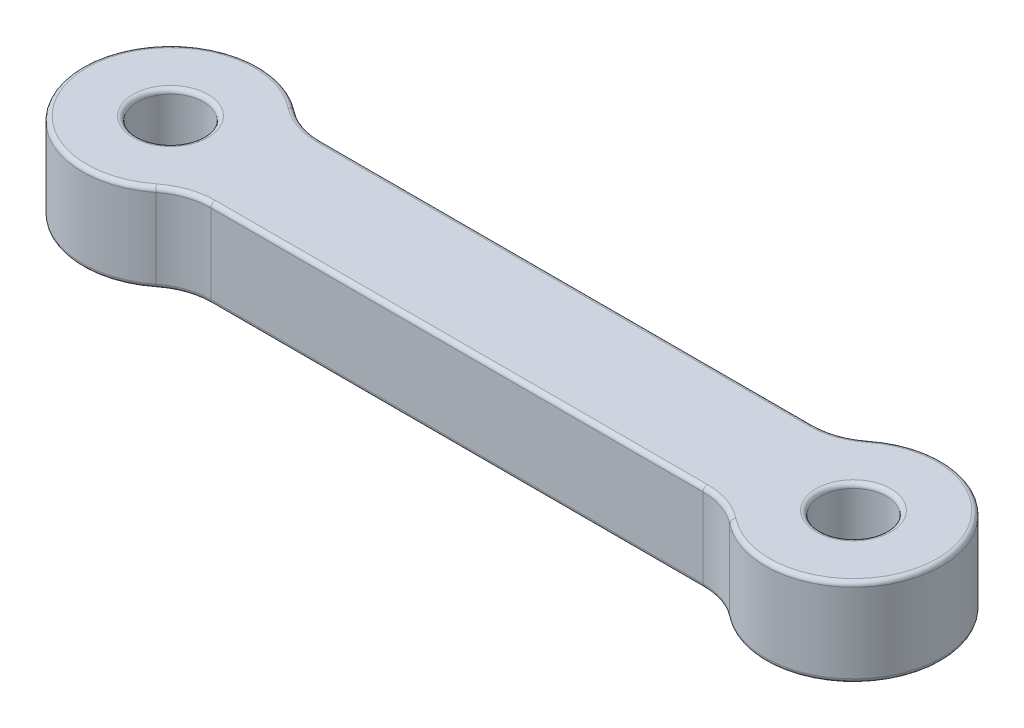
ISO-10303-21;
HEADER;
FILE_DESCRIPTION(('STEP AP214'),'2;1');
FILE_NAME('part.step','',(''),(''),'','','');
FILE_SCHEMA(('AUTOMOTIVE_DESIGN { 1 0 10303 214 1 1 1 1 }'));
ENDSEC;
DATA;
#1=APPLICATION_CONTEXT('core data for automotive mechanical design processes');
#2=APPLICATION_PROTOCOL_DEFINITION('international standard','automotive_design',2000,#1);
#3=PRODUCT_CONTEXT('',#1,'mechanical');
#4=PRODUCT('Part','Part','',(#3));
#5=PRODUCT_RELATED_PRODUCT_CATEGORY('part','',(#4));
#6=PRODUCT_DEFINITION_FORMATION('','',#4);
#7=PRODUCT_DEFINITION_CONTEXT('part definition',#1,'design');
#8=PRODUCT_DEFINITION('design','',#6,#7);
#9=PRODUCT_DEFINITION_SHAPE('','',#8);
#10=(LENGTH_UNIT() NAMED_UNIT(*) SI_UNIT(.MILLI.,.METRE.));
#11=(NAMED_UNIT(*) PLANE_ANGLE_UNIT() SI_UNIT($,.RADIAN.));
#12=(NAMED_UNIT(*) SI_UNIT($,.STERADIAN.) SOLID_ANGLE_UNIT());
#13=UNCERTAINTY_MEASURE_WITH_UNIT(LENGTH_MEASURE(1.E-05),#10,'distance_accuracy_value','');
#14=(GEOMETRIC_REPRESENTATION_CONTEXT(3) GLOBAL_UNCERTAINTY_ASSIGNED_CONTEXT((#13)) GLOBAL_UNIT_ASSIGNED_CONTEXT((#10,
#11,#12)) REPRESENTATION_CONTEXT('',''));
#15=CARTESIAN_POINT('',(0.,0.,0.));
#16=DIRECTION('',(0.,0.,1.));
#17=DIRECTION('',(1.,0.,0.));
#18=AXIS2_PLACEMENT_3D('',#15,#16,#17);
#19=CARTESIAN_POINT('',(31.,4.,0.));
#20=DIRECTION('',(0.,-1.,0.));
#21=DIRECTION('',(0.,0.,-1.));
#22=AXIS2_PLACEMENT_3D('',#19,#20,#21);
#23=CYLINDRICAL_SURFACE('',#22,4.);
#24=DIRECTION('',(0.,-1.,0.));
#25=VECTOR('',#24,1.);
#26=CARTESIAN_POINT('',(28.5256417034731,4.,3.14285714285715));
#27=LINE('',#26,#25);
#28=CARTESIAN_POINT('',(28.5256417034731,3.8,3.14285714285715));
#29=VERTEX_POINT('',#28);
#30=CARTESIAN_POINT('',(28.5256417034731,0.2,3.14285714285715));
#31=VERTEX_POINT('',#30);
#32=EDGE_CURVE('E310',#29,#31,#27,.T.);
#33=ORIENTED_EDGE('',*,*,#32,.T.);
#34=CARTESIAN_POINT('',(31.,0.2,0.));
#35=DIRECTION('',(0.,1.,0.));
#36=DIRECTION('',(0.,0.,1.));
#37=AXIS2_PLACEMENT_3D('',#34,#35,#36);
#38=CIRCLE('',#37,4.);
#39=CARTESIAN_POINT('',(28.5256417034731,0.2,-3.14285714285715));
#40=VERTEX_POINT('',#39);
#41=EDGE_CURVE('E231',#31,#40,#38,.T.);
#42=ORIENTED_EDGE('',*,*,#41,.T.);
#43=DIRECTION('',(0.,-1.,0.));
#44=VECTOR('',#43,1.);
#45=CARTESIAN_POINT('',(28.5256417034731,4.,-3.14285714285715));
#46=LINE('',#45,#44);
#47=CARTESIAN_POINT('',(28.5256417034731,3.8,-3.14285714285715));
#48=VERTEX_POINT('',#47);
#49=EDGE_CURVE('E303',#40,#48,#46,.F.);
#50=ORIENTED_EDGE('',*,*,#49,.T.);
#51=CARTESIAN_POINT('',(31.,3.8,0.));
#52=DIRECTION('',(0.,1.,0.));
#53=DIRECTION('',(0.,0.,1.));
#54=AXIS2_PLACEMENT_3D('',#51,#52,#53);
#55=CIRCLE('',#54,4.);
#56=EDGE_CURVE('E229',#48,#29,#55,.F.);
#57=ORIENTED_EDGE('',*,*,#56,.T.);
#58=EDGE_LOOP('',(#33,#42,#50,#57));
#59=FACE_BOUND('',#58,.T.);
#60=ADVANCED_FACE('F43',(#59),#23,.T.);
#61=CARTESIAN_POINT('',(0.,4.,-2.5));
#62=DIRECTION('',(0.,0.,-1.));
#63=DIRECTION('',(-1.,0.,0.));
#64=AXIS2_PLACEMENT_3D('',#61,#62,#63);
#65=PLANE('',#64);
#66=DIRECTION('',(0.,-1.,0.));
#67=VECTOR('',#66,1.);
#68=CARTESIAN_POINT('',(26.6698729810778,4.,-2.5));
#69=LINE('',#68,#67);
#70=CARTESIAN_POINT('',(26.6698729810778,3.8,-2.5));
#71=VERTEX_POINT('',#70);
#72=CARTESIAN_POINT('',(26.6698729810778,0.2,-2.5));
#73=VERTEX_POINT('',#72);
#74=EDGE_CURVE('E305',#71,#73,#69,.T.);
#75=ORIENTED_EDGE('',*,*,#74,.T.);
#76=DIRECTION('',(1.,0.,0.));
#77=VECTOR('',#76,1.);
#78=CARTESIAN_POINT('',(4.3301270189222,0.2,-2.5));
#79=LINE('',#78,#77);
#80=CARTESIAN_POINT('',(4.3301270189222,0.2,-2.5));
#81=VERTEX_POINT('',#80);
#82=EDGE_CURVE('E206',#73,#81,#79,.F.);
#83=ORIENTED_EDGE('',*,*,#82,.T.);
#84=DIRECTION('',(0.,-1.,0.));
#85=VECTOR('',#84,1.);
#86=CARTESIAN_POINT('',(4.3301270189222,4.,-2.5));
#87=LINE('',#86,#85);
#88=CARTESIAN_POINT('',(4.3301270189222,3.8,-2.5));
#89=VERTEX_POINT('',#88);
#90=EDGE_CURVE('E318',#81,#89,#87,.F.);
#91=ORIENTED_EDGE('',*,*,#90,.T.);
#92=DIRECTION('',(1.,0.,0.));
#93=VECTOR('',#92,1.);
#94=CARTESIAN_POINT('',(0.,3.8,-2.5));
#95=LINE('',#94,#93);
#96=EDGE_CURVE('E204',#89,#71,#95,.T.);
#97=ORIENTED_EDGE('',*,*,#96,.T.);
#98=EDGE_LOOP('',(#75,#83,#91,#97));
#99=FACE_BOUND('',#98,.T.);
#100=ADVANCED_FACE('F345',(#99),#65,.T.);
#101=CARTESIAN_POINT('',(0.,4.,0.));
#102=DIRECTION('',(0.,-1.,0.));
#103=DIRECTION('',(0.,0.,-1.));
#104=AXIS2_PLACEMENT_3D('',#101,#102,#103);
#105=CYLINDRICAL_SURFACE('',#104,4.);
#106=DIRECTION('',(0.,-1.,0.));
#107=VECTOR('',#106,1.);
#108=CARTESIAN_POINT('',(2.47435829652697,4.,-3.14285714285715));
#109=LINE('',#108,#107);
#110=CARTESIAN_POINT('',(2.47435829652697,3.8,-3.14285714285715));
#111=VERTEX_POINT('',#110);
#112=CARTESIAN_POINT('',(2.47435829652697,0.2,-3.14285714285715));
#113=VERTEX_POINT('',#112);
#114=EDGE_CURVE('E353',#111,#113,#109,.T.);
#115=ORIENTED_EDGE('',*,*,#114,.T.);
#116=CARTESIAN_POINT('',(0.,0.2,0.));
#117=DIRECTION('',(0.,1.,0.));
#118=DIRECTION('',(0.,0.,1.));
#119=AXIS2_PLACEMENT_3D('',#116,#117,#118);
#120=CIRCLE('',#119,4.);
#121=CARTESIAN_POINT('',(2.47435829652697,0.2,3.14285714285714));
#122=VERTEX_POINT('',#121);
#123=EDGE_CURVE('E214',#113,#122,#120,.T.);
#124=ORIENTED_EDGE('',*,*,#123,.T.);
#125=DIRECTION('',(0.,-1.,0.));
#126=VECTOR('',#125,1.);
#127=CARTESIAN_POINT('',(2.47435829652697,4.,3.14285714285714));
#128=LINE('',#127,#126);
#129=CARTESIAN_POINT('',(2.47435829652697,3.8,3.14285714285714));
#130=VERTEX_POINT('',#129);
#131=EDGE_CURVE('E348',#122,#130,#128,.F.);
#132=ORIENTED_EDGE('',*,*,#131,.T.);
#133=CARTESIAN_POINT('',(0.,3.8,0.));
#134=DIRECTION('',(0.,1.,0.));
#135=DIRECTION('',(0.,0.,1.));
#136=AXIS2_PLACEMENT_3D('',#133,#134,#135);
#137=CIRCLE('',#136,4.);
#138=EDGE_CURVE('E212',#130,#111,#137,.F.);
#139=ORIENTED_EDGE('',*,*,#138,.T.);
#140=EDGE_LOOP('',(#115,#124,#132,#139));
#141=FACE_BOUND('',#140,.T.);
#142=ADVANCED_FACE('F392',(#141),#105,.T.);
#143=CARTESIAN_POINT('',(0.,4.,2.5));
#144=DIRECTION('',(0.,0.,-1.));
#145=DIRECTION('',(-1.,0.,0.));
#146=AXIS2_PLACEMENT_3D('',#143,#144,#145);
#147=PLANE('',#146);
#148=DIRECTION('',(0.,1.,0.));
#149=VECTOR('',#148,1.);
#150=CARTESIAN_POINT('',(4.3301270189222,0.,2.5));
#151=LINE('',#150,#149);
#152=CARTESIAN_POINT('',(4.3301270189222,3.8,2.5));
#153=VERTEX_POINT('',#152);
#154=CARTESIAN_POINT('',(4.3301270189222,0.2,2.5));
#155=VERTEX_POINT('',#154);
#156=EDGE_CURVE('E358',#153,#155,#151,.F.);
#157=ORIENTED_EDGE('',*,*,#156,.T.);
#158=DIRECTION('',(1.,0.,0.));
#159=VECTOR('',#158,1.);
#160=CARTESIAN_POINT('',(0.,0.2,2.5));
#161=LINE('',#160,#159);
#162=CARTESIAN_POINT('',(26.6698729810778,0.2,2.5));
#163=VERTEX_POINT('',#162);
#164=EDGE_CURVE('E223',#155,#163,#161,.T.);
#165=ORIENTED_EDGE('',*,*,#164,.T.);
#166=DIRECTION('',(0.,1.,0.));
#167=VECTOR('',#166,1.);
#168=CARTESIAN_POINT('',(26.6698729810778,4.,2.5));
#169=LINE('',#168,#167);
#170=CARTESIAN_POINT('',(26.6698729810778,3.8,2.5));
#171=VERTEX_POINT('',#170);
#172=EDGE_CURVE('E266',#163,#171,#169,.T.);
#173=ORIENTED_EDGE('',*,*,#172,.T.);
#174=DIRECTION('',(1.,0.,0.));
#175=VECTOR('',#174,1.);
#176=CARTESIAN_POINT('',(4.3301270189222,3.8,2.5));
#177=LINE('',#176,#175);
#178=EDGE_CURVE('E221',#171,#153,#177,.F.);
#179=ORIENTED_EDGE('',*,*,#178,.T.);
#180=EDGE_LOOP('',(#157,#165,#173,#179));
#181=FACE_BOUND('',#180,.T.);
#182=ADVANCED_FACE('F368',(#181),#147,.F.);
#183=CARTESIAN_POINT('',(0.,4.,0.));
#184=DIRECTION('',(0.,1.,0.));
#185=DIRECTION('',(0.,0.,1.));
#186=AXIS2_PLACEMENT_3D('',#183,#184,#185);
#187=PLANE('',#186);
#188=CARTESIAN_POINT('',(31.,4.,0.));
#189=DIRECTION('',(0.,1.,0.));
#190=DIRECTION('',(0.,0.,1.));
#191=AXIS2_PLACEMENT_3D('',#188,#189,#190);
#192=CIRCLE('',#191,1.7);
#193=CARTESIAN_POINT('',(31.,4.,1.7));
#194=VERTEX_POINT('',#193);
#195=EDGE_CURVE('E12',#194,#194,#192,.F.);
#196=ORIENTED_EDGE('',*,*,#195,.T.);
#197=EDGE_LOOP('',(#196));
#198=FACE_BOUND('',#197,.T.);
#199=CARTESIAN_POINT('',(0.,4.,0.));
#200=DIRECTION('',(0.,1.,0.));
#201=DIRECTION('',(0.,0.,1.));
#202=AXIS2_PLACEMENT_3D('',#199,#200,#201);
#203=CIRCLE('',#202,1.7);
#204=CARTESIAN_POINT('',(0.,4.,1.7));
#205=VERTEX_POINT('',#204);
#206=EDGE_CURVE('E52',#205,#205,#203,.F.);
#207=ORIENTED_EDGE('',*,*,#206,.T.);
#208=EDGE_LOOP('',(#207));
#209=FACE_BOUND('',#208,.T.);
#210=CARTESIAN_POINT('',(0.,4.,0.));
#211=DIRECTION('',(0.,1.,0.));
#212=DIRECTION('',(0.,0.,1.));
#213=AXIS2_PLACEMENT_3D('',#210,#211,#212);
#214=CIRCLE('',#213,3.8);
#215=CARTESIAN_POINT('',(2.35064038170062,4.,-2.98571428571429));
#216=VERTEX_POINT('',#215);
#217=CARTESIAN_POINT('',(2.35064038170062,4.,2.98571428571428));
#218=VERTEX_POINT('',#217);
#219=EDGE_CURVE('E60',#216,#218,#214,.T.);
#220=ORIENTED_EDGE('',*,*,#219,.T.);
#221=CARTESIAN_POINT('',(4.3301270189222,4.,5.5));
#222=DIRECTION('',(0.,1.,0.));
#223=DIRECTION('',(0.,0.,1.));
#224=AXIS2_PLACEMENT_3D('',#221,#222,#223);
#225=CIRCLE('',#224,3.2);
#226=CARTESIAN_POINT('',(4.3301270189222,4.,2.3));
#227=VERTEX_POINT('',#226);
#228=EDGE_CURVE('E245',#218,#227,#225,.F.);
#229=ORIENTED_EDGE('',*,*,#228,.T.);
#230=DIRECTION('',(1.,0.,0.));
#231=VECTOR('',#230,1.);
#232=CARTESIAN_POINT('',(26.6698729810778,4.,2.3));
#233=LINE('',#232,#231);
#234=CARTESIAN_POINT('',(26.6698729810778,4.,2.3));
#235=VERTEX_POINT('',#234);
#236=EDGE_CURVE('E233',#227,#235,#233,.T.);
#237=ORIENTED_EDGE('',*,*,#236,.T.);
#238=CARTESIAN_POINT('',(26.6698729810778,4.,5.5));
#239=DIRECTION('',(0.,1.,0.));
#240=DIRECTION('',(0.,0.,1.));
#241=AXIS2_PLACEMENT_3D('',#238,#239,#240);
#242=CIRCLE('',#241,3.2);
#243=CARTESIAN_POINT('',(28.6493596182994,4.,2.9857142857143));
#244=VERTEX_POINT('',#243);
#245=EDGE_CURVE('E235',#235,#244,#242,.F.);
#246=ORIENTED_EDGE('',*,*,#245,.T.);
#247=CARTESIAN_POINT('',(31.,4.,0.));
#248=DIRECTION('',(0.,1.,0.));
#249=DIRECTION('',(0.,0.,1.));
#250=AXIS2_PLACEMENT_3D('',#247,#248,#249);
#251=CIRCLE('',#250,3.8);
#252=CARTESIAN_POINT('',(28.6493596182994,4.,-2.9857142857143));
#253=VERTEX_POINT('',#252);
#254=EDGE_CURVE('E237',#244,#253,#251,.T.);
#255=ORIENTED_EDGE('',*,*,#254,.T.);
#256=CARTESIAN_POINT('',(26.6698729810778,4.,-5.5));
#257=DIRECTION('',(0.,1.,0.));
#258=DIRECTION('',(0.,0.,1.));
#259=AXIS2_PLACEMENT_3D('',#256,#257,#258);
#260=CIRCLE('',#259,3.2);
#261=CARTESIAN_POINT('',(26.6698729810778,4.,-2.3));
#262=VERTEX_POINT('',#261);
#263=EDGE_CURVE('E239',#253,#262,#260,.F.);
#264=ORIENTED_EDGE('',*,*,#263,.T.);
#265=DIRECTION('',(1.,0.,0.));
#266=VECTOR('',#265,1.);
#267=CARTESIAN_POINT('',(0.,4.,-2.3));
#268=LINE('',#267,#266);
#269=CARTESIAN_POINT('',(4.3301270189222,4.,-2.3));
#270=VERTEX_POINT('',#269);
#271=EDGE_CURVE('E241',#262,#270,#268,.F.);
#272=ORIENTED_EDGE('',*,*,#271,.T.);
#273=CARTESIAN_POINT('',(4.3301270189222,4.,-5.5));
#274=DIRECTION('',(0.,1.,0.));
#275=DIRECTION('',(0.,0.,1.));
#276=AXIS2_PLACEMENT_3D('',#273,#274,#275);
#277=CIRCLE('',#276,3.2);
#278=EDGE_CURVE('E65',#270,#216,#277,.F.);
#279=ORIENTED_EDGE('',*,*,#278,.T.);
#280=EDGE_LOOP('',(#220,#229,#237,#246,#255,#264,#272,#279));
#281=FACE_BOUND('',#280,.T.);
#282=ADVANCED_FACE('F411',(#198,#209,#281),#187,.T.);
#283=CARTESIAN_POINT('',(0.,0.,0.));
#284=DIRECTION('',(0.,1.,0.));
#285=DIRECTION('',(0.,0.,1.));
#286=AXIS2_PLACEMENT_3D('',#283,#284,#285);
#287=PLANE('',#286);
#288=CARTESIAN_POINT('',(31.,0.,0.));
#289=DIRECTION('',(0.,1.,0.));
#290=DIRECTION('',(0.,0.,1.));
#291=AXIS2_PLACEMENT_3D('',#288,#289,#290);
#292=CIRCLE('',#291,1.7);
#293=CARTESIAN_POINT('',(31.,0.,1.7));
#294=VERTEX_POINT('',#293);
#295=EDGE_CURVE('E187',#294,#294,#292,.T.);
#296=ORIENTED_EDGE('',*,*,#295,.T.);
#297=EDGE_LOOP('',(#296));
#298=FACE_BOUND('',#297,.T.);
#299=CARTESIAN_POINT('',(0.,0.,0.));
#300=DIRECTION('',(0.,1.,0.));
#301=DIRECTION('',(0.,0.,1.));
#302=AXIS2_PLACEMENT_3D('',#299,#300,#301);
#303=CIRCLE('',#302,1.7);
#304=CARTESIAN_POINT('',(0.,0.,1.7));
#305=VERTEX_POINT('',#304);
#306=EDGE_CURVE('E184',#305,#305,#303,.T.);
#307=ORIENTED_EDGE('',*,*,#306,.T.);
#308=EDGE_LOOP('',(#307));
#309=FACE_BOUND('',#308,.T.);
#310=DIRECTION('',(1.,0.,0.));
#311=VECTOR('',#310,1.);
#312=CARTESIAN_POINT('',(26.6698729810778,0.,-2.3));
#313=LINE('',#312,#311);
#314=CARTESIAN_POINT('',(4.3301270189222,0.,-2.3));
#315=VERTEX_POINT('',#314);
#316=CARTESIAN_POINT('',(26.6698729810778,0.,-2.3));
#317=VERTEX_POINT('',#316);
#318=EDGE_CURVE('E182',#315,#317,#313,.T.);
#319=ORIENTED_EDGE('',*,*,#318,.T.);
#320=CARTESIAN_POINT('',(26.6698729810778,0.,-5.5));
#321=DIRECTION('',(0.,1.,0.));
#322=DIRECTION('',(0.,0.,1.));
#323=AXIS2_PLACEMENT_3D('',#320,#321,#322);
#324=CIRCLE('',#323,3.2);
#325=CARTESIAN_POINT('',(28.6493596182994,0.,-2.9857142857143));
#326=VERTEX_POINT('',#325);
#327=EDGE_CURVE('E163',#317,#326,#324,.T.);
#328=ORIENTED_EDGE('',*,*,#327,.T.);
#329=CARTESIAN_POINT('',(31.,0.,0.));
#330=DIRECTION('',(0.,1.,0.));
#331=DIRECTION('',(0.,0.,1.));
#332=AXIS2_PLACEMENT_3D('',#329,#330,#331);
#333=CIRCLE('',#332,3.8);
#334=CARTESIAN_POINT('',(28.6493596182994,0.,2.9857142857143));
#335=VERTEX_POINT('',#334);
#336=EDGE_CURVE('E171',#326,#335,#333,.F.);
#337=ORIENTED_EDGE('',*,*,#336,.T.);
#338=CARTESIAN_POINT('',(26.6698729810778,0.,5.5));
#339=DIRECTION('',(0.,1.,0.));
#340=DIRECTION('',(0.,0.,1.));
#341=AXIS2_PLACEMENT_3D('',#338,#339,#340);
#342=CIRCLE('',#341,3.2);
#343=CARTESIAN_POINT('',(26.6698729810778,0.,2.3));
#344=VERTEX_POINT('',#343);
#345=EDGE_CURVE('E177',#335,#344,#342,.T.);
#346=ORIENTED_EDGE('',*,*,#345,.T.);
#347=DIRECTION('',(1.,0.,0.));
#348=VECTOR('',#347,1.);
#349=CARTESIAN_POINT('',(0.,0.,2.3));
#350=LINE('',#349,#348);
#351=CARTESIAN_POINT('',(4.3301270189222,0.,2.3));
#352=VERTEX_POINT('',#351);
#353=EDGE_CURVE('E327',#344,#352,#350,.F.);
#354=ORIENTED_EDGE('',*,*,#353,.T.);
#355=CARTESIAN_POINT('',(4.3301270189222,0.,5.5));
#356=DIRECTION('',(0.,1.,0.));
#357=DIRECTION('',(0.,0.,1.));
#358=AXIS2_PLACEMENT_3D('',#355,#356,#357);
#359=CIRCLE('',#358,3.2);
#360=CARTESIAN_POINT('',(2.35064038170062,0.,2.98571428571428));
#361=VERTEX_POINT('',#360);
#362=EDGE_CURVE('E329',#352,#361,#359,.T.);
#363=ORIENTED_EDGE('',*,*,#362,.T.);
#364=CARTESIAN_POINT('',(0.,0.,0.));
#365=DIRECTION('',(0.,1.,0.));
#366=DIRECTION('',(0.,0.,1.));
#367=AXIS2_PLACEMENT_3D('',#364,#365,#366);
#368=CIRCLE('',#367,3.8);
#369=CARTESIAN_POINT('',(2.35064038170062,0.,-2.98571428571429));
#370=VERTEX_POINT('',#369);
#371=EDGE_CURVE('E331',#361,#370,#368,.F.);
#372=ORIENTED_EDGE('',*,*,#371,.T.);
#373=CARTESIAN_POINT('',(4.3301270189222,0.,-5.5));
#374=DIRECTION('',(0.,1.,0.));
#375=DIRECTION('',(0.,0.,1.));
#376=AXIS2_PLACEMENT_3D('',#373,#374,#375);
#377=CIRCLE('',#376,3.2);
#378=EDGE_CURVE('E189',#370,#315,#377,.T.);
#379=ORIENTED_EDGE('',*,*,#378,.T.);
#380=EDGE_LOOP('',(#319,#328,#337,#346,#354,#363,#372,#379));
#381=FACE_BOUND('',#380,.T.);
#382=ADVANCED_FACE('F180',(#298,#309,#381),#287,.F.);
#383=CARTESIAN_POINT('',(4.3301270189222,4.,5.5));
#384=DIRECTION('',(0.,-1.,0.));
#385=DIRECTION('',(0.,0.,-1.));
#386=AXIS2_PLACEMENT_3D('',#383,#384,#385);
#387=CYLINDRICAL_SURFACE('',#386,3.);
#388=ORIENTED_EDGE('',*,*,#131,.F.);
#389=CARTESIAN_POINT('',(4.3301270189222,0.2,5.5));
#390=DIRECTION('',(0.,1.,0.));
#391=DIRECTION('',(0.,0.,1.));
#392=AXIS2_PLACEMENT_3D('',#389,#390,#391);
#393=CIRCLE('',#392,3.);
#394=EDGE_CURVE('E219',#122,#155,#393,.F.);
#395=ORIENTED_EDGE('',*,*,#394,.T.);
#396=ORIENTED_EDGE('',*,*,#156,.F.);
#397=CARTESIAN_POINT('',(4.3301270189222,3.8,5.5));
#398=DIRECTION('',(0.,1.,0.));
#399=DIRECTION('',(0.,0.,1.));
#400=AXIS2_PLACEMENT_3D('',#397,#398,#399);
#401=CIRCLE('',#400,3.);
#402=EDGE_CURVE('E216',#153,#130,#401,.T.);
#403=ORIENTED_EDGE('',*,*,#402,.T.);
#404=EDGE_LOOP('',(#388,#395,#396,#403));
#405=FACE_BOUND('',#404,.T.);
#406=ADVANCED_FACE('F389',(#405),#387,.F.);
#407=CARTESIAN_POINT('',(26.6698729810778,4.,5.5));
#408=DIRECTION('',(0.,-1.,0.));
#409=DIRECTION('',(0.,0.,-1.));
#410=AXIS2_PLACEMENT_3D('',#407,#408,#409);
#411=CYLINDRICAL_SURFACE('',#410,3.);
#412=ORIENTED_EDGE('',*,*,#172,.F.);
#413=CARTESIAN_POINT('',(26.6698729810778,0.2,5.5));
#414=DIRECTION('',(0.,1.,0.));
#415=DIRECTION('',(0.,0.,1.));
#416=AXIS2_PLACEMENT_3D('',#413,#414,#415);
#417=CIRCLE('',#416,3.);
#418=EDGE_CURVE('E227',#163,#31,#417,.F.);
#419=ORIENTED_EDGE('',*,*,#418,.T.);
#420=ORIENTED_EDGE('',*,*,#32,.F.);
#421=CARTESIAN_POINT('',(26.6698729810778,3.8,5.5));
#422=DIRECTION('',(0.,1.,0.));
#423=DIRECTION('',(0.,0.,1.));
#424=AXIS2_PLACEMENT_3D('',#421,#422,#423);
#425=CIRCLE('',#424,3.);
#426=EDGE_CURVE('E225',#29,#171,#425,.T.);
#427=ORIENTED_EDGE('',*,*,#426,.T.);
#428=EDGE_LOOP('',(#412,#419,#420,#427));
#429=FACE_BOUND('',#428,.T.);
#430=ADVANCED_FACE('F408',(#429),#411,.F.);
#431=CARTESIAN_POINT('',(26.6698729810778,4.,-5.5));
#432=DIRECTION('',(0.,-1.,0.));
#433=DIRECTION('',(0.,0.,-1.));
#434=AXIS2_PLACEMENT_3D('',#431,#432,#433);
#435=CYLINDRICAL_SURFACE('',#434,3.);
#436=ORIENTED_EDGE('',*,*,#49,.F.);
#437=CARTESIAN_POINT('',(26.6698729810778,0.2,-5.5));
#438=DIRECTION('',(0.,1.,0.));
#439=DIRECTION('',(0.,0.,1.));
#440=AXIS2_PLACEMENT_3D('',#437,#438,#439);
#441=CIRCLE('',#440,3.);
#442=EDGE_CURVE('E165',#40,#73,#441,.F.);
#443=ORIENTED_EDGE('',*,*,#442,.T.);
#444=ORIENTED_EDGE('',*,*,#74,.F.);
#445=CARTESIAN_POINT('',(26.6698729810778,3.8,-5.5));
#446=DIRECTION('',(0.,1.,0.));
#447=DIRECTION('',(0.,0.,1.));
#448=AXIS2_PLACEMENT_3D('',#445,#446,#447);
#449=CIRCLE('',#448,3.);
#450=EDGE_CURVE('E201',#71,#48,#449,.T.);
#451=ORIENTED_EDGE('',*,*,#450,.T.);
#452=EDGE_LOOP('',(#436,#443,#444,#451));
#453=FACE_BOUND('',#452,.T.);
#454=ADVANCED_FACE('F302',(#453),#435,.F.);
#455=CARTESIAN_POINT('',(4.3301270189222,4.,-5.5));
#456=DIRECTION('',(0.,-1.,0.));
#457=DIRECTION('',(0.,0.,-1.));
#458=AXIS2_PLACEMENT_3D('',#455,#456,#457);
#459=CYLINDRICAL_SURFACE('',#458,3.);
#460=ORIENTED_EDGE('',*,*,#90,.F.);
#461=CARTESIAN_POINT('',(4.3301270189222,0.2,-5.5));
#462=DIRECTION('',(0.,1.,0.));
#463=DIRECTION('',(0.,0.,1.));
#464=AXIS2_PLACEMENT_3D('',#461,#462,#463);
#465=CIRCLE('',#464,3.);
#466=EDGE_CURVE('E210',#81,#113,#465,.F.);
#467=ORIENTED_EDGE('',*,*,#466,.T.);
#468=ORIENTED_EDGE('',*,*,#114,.F.);
#469=CARTESIAN_POINT('',(4.3301270189222,3.8,-5.5));
#470=DIRECTION('',(0.,1.,0.));
#471=DIRECTION('',(0.,0.,1.));
#472=AXIS2_PLACEMENT_3D('',#469,#470,#471);
#473=CIRCLE('',#472,3.);
#474=EDGE_CURVE('E208',#111,#89,#473,.T.);
#475=ORIENTED_EDGE('',*,*,#474,.T.);
#476=EDGE_LOOP('',(#460,#467,#468,#475));
#477=FACE_BOUND('',#476,.T.);
#478=ADVANCED_FACE('F604',(#477),#459,.F.);
#479=CARTESIAN_POINT('',(0.,4.,0.));
#480=DIRECTION('',(0.,-1.,0.));
#481=DIRECTION('',(0.,0.,-1.));
#482=AXIS2_PLACEMENT_3D('',#479,#480,#481);
#483=CYLINDRICAL_SURFACE('',#482,1.5);
#484=CARTESIAN_POINT('',(0.,0.2,0.));
#485=DIRECTION('',(0.,1.,0.));
#486=DIRECTION('',(0.,0.,1.));
#487=AXIS2_PLACEMENT_3D('',#484,#485,#486);
#488=CIRCLE('',#487,1.5);
#489=CARTESIAN_POINT('',(0.,0.2,1.5));
#490=VERTEX_POINT('',#489);
#491=EDGE_CURVE('E198',#490,#490,#488,.F.);
#492=ORIENTED_EDGE('',*,*,#491,.T.);
#493=EDGE_LOOP('',(#492));
#494=FACE_BOUND('',#493,.T.);
#495=CARTESIAN_POINT('',(0.,3.8,0.));
#496=DIRECTION('',(0.,1.,0.));
#497=DIRECTION('',(0.,0.,1.));
#498=AXIS2_PLACEMENT_3D('',#495,#496,#497);
#499=CIRCLE('',#498,1.5);
#500=CARTESIAN_POINT('',(0.,3.8,1.5));
#501=VERTEX_POINT('',#500);
#502=EDGE_CURVE('E195',#501,#501,#499,.T.);
#503=ORIENTED_EDGE('',*,*,#502,.T.);
#504=EDGE_LOOP('',(#503));
#505=FACE_BOUND('',#504,.T.);
#506=ADVANCED_FACE('F594',(#494,#505),#483,.F.);
#507=CARTESIAN_POINT('',(31.,4.,0.));
#508=DIRECTION('',(0.,-1.,0.));
#509=DIRECTION('',(0.,0.,-1.));
#510=AXIS2_PLACEMENT_3D('',#507,#508,#509);
#511=CYLINDRICAL_SURFACE('',#510,1.5);
#512=CARTESIAN_POINT('',(31.,0.2,0.));
#513=DIRECTION('',(0.,1.,0.));
#514=DIRECTION('',(0.,0.,1.));
#515=AXIS2_PLACEMENT_3D('',#512,#513,#514);
#516=CIRCLE('',#515,1.5);
#517=CARTESIAN_POINT('',(31.,0.2,1.5));
#518=VERTEX_POINT('',#517);
#519=EDGE_CURVE('E178',#518,#518,#516,.F.);
#520=ORIENTED_EDGE('',*,*,#519,.T.);
#521=EDGE_LOOP('',(#520));
#522=FACE_BOUND('',#521,.T.);
#523=CARTESIAN_POINT('',(31.,3.8,0.));
#524=DIRECTION('',(0.,1.,0.));
#525=DIRECTION('',(0.,0.,1.));
#526=AXIS2_PLACEMENT_3D('',#523,#524,#525);
#527=CIRCLE('',#526,1.5);
#528=CARTESIAN_POINT('',(31.,3.8,1.5));
#529=VERTEX_POINT('',#528);
#530=EDGE_CURVE('E316',#529,#529,#527,.T.);
#531=ORIENTED_EDGE('',*,*,#530,.T.);
#532=EDGE_LOOP('',(#531));
#533=FACE_BOUND('',#532,.T.);
#534=ADVANCED_FACE('F437',(#522,#533),#511,.F.);
#535=CARTESIAN_POINT('',(31.,0.2,0.));
#536=DIRECTION('',(0.,1.,0.));
#537=DIRECTION('',(0.,0.,1.));
#538=AXIS2_PLACEMENT_3D('',#535,#536,#537);
#539=TOROIDAL_SURFACE('',#538,1.7,0.2);
#540=ORIENTED_EDGE('',*,*,#295,.F.);
#541=EDGE_LOOP('',(#540));
#542=FACE_BOUND('',#541,.T.);
#543=ORIENTED_EDGE('',*,*,#519,.F.);
#544=EDGE_LOOP('',(#543));
#545=FACE_BOUND('',#544,.T.);
#546=ADVANCED_FACE('F433',(#542,#545),#539,.T.);
#547=CARTESIAN_POINT('',(0.,0.2,0.));
#548=DIRECTION('',(0.,1.,0.));
#549=DIRECTION('',(0.,0.,1.));
#550=AXIS2_PLACEMENT_3D('',#547,#548,#549);
#551=TOROIDAL_SURFACE('',#550,1.7,0.2);
#552=ORIENTED_EDGE('',*,*,#306,.F.);
#553=EDGE_LOOP('',(#552));
#554=FACE_BOUND('',#553,.T.);
#555=ORIENTED_EDGE('',*,*,#491,.F.);
#556=EDGE_LOOP('',(#555));
#557=FACE_BOUND('',#556,.T.);
#558=ADVANCED_FACE('F436',(#554,#557),#551,.T.);
#559=CARTESIAN_POINT('',(4.3301270189222,0.2,5.5));
#560=DIRECTION('',(0.,1.,0.));
#561=DIRECTION('',(0.,0.,1.));
#562=AXIS2_PLACEMENT_3D('',#559,#560,#561);
#563=TOROIDAL_SURFACE('',#562,3.2,0.2);
#564=CARTESIAN_POINT('',(4.3301270189222,0.2,2.3));
#565=DIRECTION('',(1.,0.,0.));
#566=DIRECTION('',(0.,0.,-1.));
#567=AXIS2_PLACEMENT_3D('',#564,#565,#566);
#568=CIRCLE('',#567,0.2);
#569=EDGE_CURVE('E260',#155,#352,#568,.T.);
#570=ORIENTED_EDGE('',*,*,#569,.F.);
#571=ORIENTED_EDGE('',*,*,#394,.F.);
#572=CARTESIAN_POINT('',(2.35064038170062,0.2,2.98571428571428));
#573=DIRECTION('',(-0.785714285714285,0.,0.618589574131743));
#574=DIRECTION('',(0.618589574131743,0.,0.785714285714285));
#575=AXIS2_PLACEMENT_3D('',#572,#573,#574);
#576=CIRCLE('',#575,0.2);
#577=EDGE_CURVE('E263',#361,#122,#576,.T.);
#578=ORIENTED_EDGE('',*,*,#577,.F.);
#579=ORIENTED_EDGE('',*,*,#362,.F.);
#580=EDGE_LOOP('',(#570,#571,#578,#579));
#581=FACE_BOUND('',#580,.T.);
#582=ADVANCED_FACE('F401',(#581),#563,.T.);
#583=CARTESIAN_POINT('',(0.,0.2,0.));
#584=DIRECTION('',(0.,1.,0.));
#585=DIRECTION('',(0.,0.,1.));
#586=AXIS2_PLACEMENT_3D('',#583,#584,#585);
#587=TOROIDAL_SURFACE('',#586,3.8,0.2);
#588=ORIENTED_EDGE('',*,*,#577,.T.);
#589=ORIENTED_EDGE('',*,*,#123,.F.);
#590=CARTESIAN_POINT('',(2.35064038170062,0.2,-2.98571428571429));
#591=DIRECTION('',(0.785714285714285,0.,0.618589574131743));
#592=DIRECTION('',(0.618589574131743,0.,-0.785714285714285));
#593=AXIS2_PLACEMENT_3D('',#590,#591,#592);
#594=CIRCLE('',#593,0.2);
#595=EDGE_CURVE('E257',#370,#113,#594,.T.);
#596=ORIENTED_EDGE('',*,*,#595,.F.);
#597=ORIENTED_EDGE('',*,*,#371,.F.);
#598=EDGE_LOOP('',(#588,#589,#596,#597));
#599=FACE_BOUND('',#598,.T.);
#600=ADVANCED_FACE('F396',(#599),#587,.T.);
#601=CARTESIAN_POINT('',(0.,0.2,2.3));
#602=DIRECTION('',(1.,0.,0.));
#603=DIRECTION('',(0.,0.,-1.));
#604=AXIS2_PLACEMENT_3D('',#601,#602,#603);
#605=CYLINDRICAL_SURFACE('',#604,0.2);
#606=ORIENTED_EDGE('',*,*,#569,.T.);
#607=ORIENTED_EDGE('',*,*,#353,.F.);
#608=CARTESIAN_POINT('',(26.6698729810778,0.2,2.3));
#609=DIRECTION('',(1.,0.,0.));
#610=DIRECTION('',(0.,0.,-1.));
#611=AXIS2_PLACEMENT_3D('',#608,#609,#610);
#612=CIRCLE('',#611,0.2);
#613=EDGE_CURVE('E254',#163,#344,#612,.T.);
#614=ORIENTED_EDGE('',*,*,#613,.F.);
#615=ORIENTED_EDGE('',*,*,#164,.F.);
#616=EDGE_LOOP('',(#606,#607,#614,#615));
#617=FACE_BOUND('',#616,.T.);
#618=ADVANCED_FACE('F404',(#617),#605,.T.);
#619=CARTESIAN_POINT('',(4.3301270189222,0.2,-5.5));
#620=DIRECTION('',(0.,1.,0.));
#621=DIRECTION('',(0.,0.,1.));
#622=AXIS2_PLACEMENT_3D('',#619,#620,#621);
#623=TOROIDAL_SURFACE('',#622,3.2,0.2);
#624=ORIENTED_EDGE('',*,*,#595,.T.);
#625=ORIENTED_EDGE('',*,*,#466,.F.);
#626=CARTESIAN_POINT('',(4.3301270189222,0.2,-2.3));
#627=DIRECTION('',(1.,0.,0.));
#628=DIRECTION('',(0.,0.,-1.));
#629=AXIS2_PLACEMENT_3D('',#626,#627,#628);
#630=CIRCLE('',#629,0.2);
#631=EDGE_CURVE('E251',#315,#81,#630,.T.);
#632=ORIENTED_EDGE('',*,*,#631,.F.);
#633=ORIENTED_EDGE('',*,*,#378,.F.);
#634=EDGE_LOOP('',(#624,#625,#632,#633));
#635=FACE_BOUND('',#634,.T.);
#636=ADVANCED_FACE('F338',(#635),#623,.T.);
#637=CARTESIAN_POINT('',(26.6698729810778,0.2,5.5));
#638=DIRECTION('',(0.,1.,0.));
#639=DIRECTION('',(0.,0.,1.));
#640=AXIS2_PLACEMENT_3D('',#637,#638,#639);
#641=TOROIDAL_SURFACE('',#640,3.2,0.2);
#642=ORIENTED_EDGE('',*,*,#613,.T.);
#643=ORIENTED_EDGE('',*,*,#345,.F.);
#644=CARTESIAN_POINT('',(28.6493596182994,0.2,2.9857142857143));
#645=DIRECTION('',(0.785714285714282,0.,0.618589574131746));
#646=DIRECTION('',(0.618589574131746,0.,-0.785714285714282));
#647=AXIS2_PLACEMENT_3D('',#644,#645,#646);
#648=CIRCLE('',#647,0.2);
#649=EDGE_CURVE('E174',#31,#335,#648,.T.);
#650=ORIENTED_EDGE('',*,*,#649,.F.);
#651=ORIENTED_EDGE('',*,*,#418,.F.);
#652=EDGE_LOOP('',(#642,#643,#650,#651));
#653=FACE_BOUND('',#652,.T.);
#654=ADVANCED_FACE('F407',(#653),#641,.T.);
#655=CARTESIAN_POINT('',(0.,0.2,-2.3));
#656=DIRECTION('',(-1.,0.,0.));
#657=DIRECTION('',(0.,0.,1.));
#658=AXIS2_PLACEMENT_3D('',#655,#656,#657);
#659=CYLINDRICAL_SURFACE('',#658,0.2);
#660=ORIENTED_EDGE('',*,*,#631,.T.);
#661=ORIENTED_EDGE('',*,*,#82,.F.);
#662=CARTESIAN_POINT('',(26.6698729810778,0.2,-2.3));
#663=DIRECTION('',(1.,0.,0.));
#664=DIRECTION('',(0.,0.,-1.));
#665=AXIS2_PLACEMENT_3D('',#662,#663,#664);
#666=CIRCLE('',#665,0.2);
#667=EDGE_CURVE('E168',#317,#73,#666,.T.);
#668=ORIENTED_EDGE('',*,*,#667,.F.);
#669=ORIENTED_EDGE('',*,*,#318,.F.);
#670=EDGE_LOOP('',(#660,#661,#668,#669));
#671=FACE_BOUND('',#670,.T.);
#672=ADVANCED_FACE('F341',(#671),#659,.T.);
#673=CARTESIAN_POINT('',(31.,0.2,0.));
#674=DIRECTION('',(0.,1.,0.));
#675=DIRECTION('',(0.,0.,1.));
#676=AXIS2_PLACEMENT_3D('',#673,#674,#675);
#677=TOROIDAL_SURFACE('',#676,3.8,0.2);
#678=ORIENTED_EDGE('',*,*,#649,.T.);
#679=ORIENTED_EDGE('',*,*,#336,.F.);
#680=CARTESIAN_POINT('',(28.6493596182994,0.2,-2.9857142857143));
#681=DIRECTION('',(-0.785714285714285,0.,0.618589574131743));
#682=DIRECTION('',(0.618589574131743,0.,0.785714285714285));
#683=AXIS2_PLACEMENT_3D('',#680,#681,#682);
#684=CIRCLE('',#683,0.2);
#685=EDGE_CURVE('E159',#40,#326,#684,.T.);
#686=ORIENTED_EDGE('',*,*,#685,.F.);
#687=ORIENTED_EDGE('',*,*,#41,.F.);
#688=EDGE_LOOP('',(#678,#679,#686,#687));
#689=FACE_BOUND('',#688,.T.);
#690=ADVANCED_FACE('F172',(#689),#677,.T.);
#691=CARTESIAN_POINT('',(26.6698729810778,0.2,-5.5));
#692=DIRECTION('',(0.,1.,0.));
#693=DIRECTION('',(0.,0.,1.));
#694=AXIS2_PLACEMENT_3D('',#691,#692,#693);
#695=TOROIDAL_SURFACE('',#694,3.2,0.2);
#696=ORIENTED_EDGE('',*,*,#667,.T.);
#697=ORIENTED_EDGE('',*,*,#442,.F.);
#698=ORIENTED_EDGE('',*,*,#685,.T.);
#699=ORIENTED_EDGE('',*,*,#327,.F.);
#700=EDGE_LOOP('',(#696,#697,#698,#699));
#701=FACE_BOUND('',#700,.T.);
#702=ADVANCED_FACE('F161',(#701),#695,.T.);
#703=CARTESIAN_POINT('',(31.,3.8,0.));
#704=DIRECTION('',(0.,1.,0.));
#705=DIRECTION('',(0.,0.,1.));
#706=AXIS2_PLACEMENT_3D('',#703,#704,#705);
#707=TOROIDAL_SURFACE('',#706,1.7,0.2);
#708=ORIENTED_EDGE('',*,*,#530,.F.);
#709=EDGE_LOOP('',(#708));
#710=FACE_BOUND('',#709,.T.);
#711=ORIENTED_EDGE('',*,*,#195,.F.);
#712=EDGE_LOOP('',(#711));
#713=FACE_BOUND('',#712,.T.);
#714=ADVANCED_FACE('F444',(#710,#713),#707,.T.);
#715=CARTESIAN_POINT('',(0.,3.8,0.));
#716=DIRECTION('',(0.,1.,0.));
#717=DIRECTION('',(0.,0.,1.));
#718=AXIS2_PLACEMENT_3D('',#715,#716,#717);
#719=TOROIDAL_SURFACE('',#718,1.7,0.2);
#720=ORIENTED_EDGE('',*,*,#502,.F.);
#721=EDGE_LOOP('',(#720));
#722=FACE_BOUND('',#721,.T.);
#723=ORIENTED_EDGE('',*,*,#206,.F.);
#724=EDGE_LOOP('',(#723));
#725=FACE_BOUND('',#724,.T.);
#726=ADVANCED_FACE('F461',(#722,#725),#719,.T.);
#727=CARTESIAN_POINT('',(26.6698729810778,3.8,-5.5));
#728=DIRECTION('',(0.,1.,0.));
#729=DIRECTION('',(0.,0.,1.));
#730=AXIS2_PLACEMENT_3D('',#727,#728,#729);
#731=TOROIDAL_SURFACE('',#730,3.2,0.2);
#732=CARTESIAN_POINT('',(28.6493596182994,3.8,-2.9857142857143));
#733=DIRECTION('',(0.785714285714282,0.,-0.618589574131746));
#734=DIRECTION('',(-0.618589574131746,0.,-0.785714285714282));
#735=AXIS2_PLACEMENT_3D('',#732,#733,#734);
#736=CIRCLE('',#735,0.2);
#737=EDGE_CURVE('E282',#48,#253,#736,.T.);
#738=ORIENTED_EDGE('',*,*,#737,.F.);
#739=ORIENTED_EDGE('',*,*,#450,.F.);
#740=CARTESIAN_POINT('',(26.6698729810778,3.8,-2.3));
#741=DIRECTION('',(-1.,0.,0.));
#742=DIRECTION('',(0.,0.,1.));
#743=AXIS2_PLACEMENT_3D('',#740,#741,#742);
#744=CIRCLE('',#743,0.2);
#745=EDGE_CURVE('E47',#262,#71,#744,.T.);
#746=ORIENTED_EDGE('',*,*,#745,.F.);
#747=ORIENTED_EDGE('',*,*,#263,.F.);
#748=EDGE_LOOP('',(#738,#739,#746,#747));
#749=FACE_BOUND('',#748,.T.);
#750=ADVANCED_FACE('F45',(#749),#731,.T.);
#751=CARTESIAN_POINT('',(0.,3.8,-2.3));
#752=DIRECTION('',(1.,0.,0.));
#753=DIRECTION('',(0.,0.,-1.));
#754=AXIS2_PLACEMENT_3D('',#751,#752,#753);
#755=CYLINDRICAL_SURFACE('',#754,0.2);
#756=ORIENTED_EDGE('',*,*,#745,.T.);
#757=ORIENTED_EDGE('',*,*,#96,.F.);
#758=CARTESIAN_POINT('',(4.3301270189222,3.8,-2.3));
#759=DIRECTION('',(-1.,0.,0.));
#760=DIRECTION('',(0.,0.,1.));
#761=AXIS2_PLACEMENT_3D('',#758,#759,#760);
#762=CIRCLE('',#761,0.2);
#763=EDGE_CURVE('E280',#270,#89,#762,.T.);
#764=ORIENTED_EDGE('',*,*,#763,.F.);
#765=ORIENTED_EDGE('',*,*,#271,.F.);
#766=EDGE_LOOP('',(#756,#757,#764,#765));
#767=FACE_BOUND('',#766,.T.);
#768=ADVANCED_FACE('F293',(#767),#755,.T.);
#769=CARTESIAN_POINT('',(31.,3.8,0.));
#770=DIRECTION('',(0.,1.,0.));
#771=DIRECTION('',(0.,0.,1.));
#772=AXIS2_PLACEMENT_3D('',#769,#770,#771);
#773=TOROIDAL_SURFACE('',#772,3.8,0.2);
#774=ORIENTED_EDGE('',*,*,#737,.T.);
#775=ORIENTED_EDGE('',*,*,#254,.F.);
#776=CARTESIAN_POINT('',(28.6493596182994,3.8,2.9857142857143));
#777=DIRECTION('',(-0.785714285714286,0.,-0.618589574131742));
#778=DIRECTION('',(-0.618589574131742,0.,0.785714285714286));
#779=AXIS2_PLACEMENT_3D('',#776,#777,#778);
#780=CIRCLE('',#779,0.2);
#781=EDGE_CURVE('E277',#29,#244,#780,.T.);
#782=ORIENTED_EDGE('',*,*,#781,.F.);
#783=ORIENTED_EDGE('',*,*,#56,.F.);
#784=EDGE_LOOP('',(#774,#775,#782,#783));
#785=FACE_BOUND('',#784,.T.);
#786=ADVANCED_FACE('F410',(#785),#773,.T.);
#787=CARTESIAN_POINT('',(4.3301270189222,3.8,-5.5));
#788=DIRECTION('',(0.,1.,0.));
#789=DIRECTION('',(0.,0.,1.));
#790=AXIS2_PLACEMENT_3D('',#787,#788,#789);
#791=TOROIDAL_SURFACE('',#790,3.2,0.2);
#792=ORIENTED_EDGE('',*,*,#763,.T.);
#793=ORIENTED_EDGE('',*,*,#474,.F.);
#794=CARTESIAN_POINT('',(2.35064038170062,3.8,-2.98571428571429));
#795=DIRECTION('',(-0.785714285714286,0.,-0.618589574131742));
#796=DIRECTION('',(-0.618589574131742,0.,0.785714285714286));
#797=AXIS2_PLACEMENT_3D('',#794,#795,#796);
#798=CIRCLE('',#797,0.2);
#799=EDGE_CURVE('E274',#216,#111,#798,.T.);
#800=ORIENTED_EDGE('',*,*,#799,.F.);
#801=ORIENTED_EDGE('',*,*,#278,.F.);
#802=EDGE_LOOP('',(#792,#793,#800,#801));
#803=FACE_BOUND('',#802,.T.);
#804=ADVANCED_FACE('F414',(#803),#791,.T.);
#805=CARTESIAN_POINT('',(26.6698729810778,3.8,5.5));
#806=DIRECTION('',(0.,1.,0.));
#807=DIRECTION('',(0.,0.,1.));
#808=AXIS2_PLACEMENT_3D('',#805,#806,#807);
#809=TOROIDAL_SURFACE('',#808,3.2,0.2);
#810=ORIENTED_EDGE('',*,*,#781,.T.);
#811=ORIENTED_EDGE('',*,*,#245,.F.);
#812=CARTESIAN_POINT('',(26.6698729810778,3.8,2.3));
#813=DIRECTION('',(-1.,0.,0.));
#814=DIRECTION('',(0.,0.,1.));
#815=AXIS2_PLACEMENT_3D('',#812,#813,#814);
#816=CIRCLE('',#815,0.2);
#817=EDGE_CURVE('E271',#171,#235,#816,.T.);
#818=ORIENTED_EDGE('',*,*,#817,.F.);
#819=ORIENTED_EDGE('',*,*,#426,.F.);
#820=EDGE_LOOP('',(#810,#811,#818,#819));
#821=FACE_BOUND('',#820,.T.);
#822=ADVANCED_FACE('F377',(#821),#809,.T.);
#823=CARTESIAN_POINT('',(0.,3.8,0.));
#824=DIRECTION('',(0.,1.,0.));
#825=DIRECTION('',(0.,0.,1.));
#826=AXIS2_PLACEMENT_3D('',#823,#824,#825);
#827=TOROIDAL_SURFACE('',#826,3.8,0.2);
#828=ORIENTED_EDGE('',*,*,#799,.T.);
#829=ORIENTED_EDGE('',*,*,#138,.F.);
#830=CARTESIAN_POINT('',(2.35064038170062,3.8,2.98571428571428));
#831=DIRECTION('',(0.785714285714288,0.,-0.618589574131739));
#832=DIRECTION('',(-0.618589574131739,0.,-0.785714285714288));
#833=AXIS2_PLACEMENT_3D('',#830,#831,#832);
#834=CIRCLE('',#833,0.2);
#835=EDGE_CURVE('E269',#218,#130,#834,.T.);
#836=ORIENTED_EDGE('',*,*,#835,.F.);
#837=ORIENTED_EDGE('',*,*,#219,.F.);
#838=EDGE_LOOP('',(#828,#829,#836,#837));
#839=FACE_BOUND('',#838,.T.);
#840=ADVANCED_FACE('F416',(#839),#827,.T.);
#841=CARTESIAN_POINT('',(0.,3.8,2.3));
#842=DIRECTION('',(-1.,0.,0.));
#843=DIRECTION('',(0.,0.,1.));
#844=AXIS2_PLACEMENT_3D('',#841,#842,#843);
#845=CYLINDRICAL_SURFACE('',#844,0.2);
#846=ORIENTED_EDGE('',*,*,#817,.T.);
#847=ORIENTED_EDGE('',*,*,#236,.F.);
#848=CARTESIAN_POINT('',(4.3301270189222,3.8,2.3));
#849=DIRECTION('',(-1.,0.,0.));
#850=DIRECTION('',(0.,0.,1.));
#851=AXIS2_PLACEMENT_3D('',#848,#849,#850);
#852=CIRCLE('',#851,0.2);
#853=EDGE_CURVE('E267',#153,#227,#852,.T.);
#854=ORIENTED_EDGE('',*,*,#853,.F.);
#855=ORIENTED_EDGE('',*,*,#178,.F.);
#856=EDGE_LOOP('',(#846,#847,#854,#855));
#857=FACE_BOUND('',#856,.T.);
#858=ADVANCED_FACE('F381',(#857),#845,.T.);
#859=CARTESIAN_POINT('',(4.3301270189222,3.8,5.5));
#860=DIRECTION('',(0.,1.,0.));
#861=DIRECTION('',(0.,0.,1.));
#862=AXIS2_PLACEMENT_3D('',#859,#860,#861);
#863=TOROIDAL_SURFACE('',#862,3.2,0.2);
#864=ORIENTED_EDGE('',*,*,#835,.T.);
#865=ORIENTED_EDGE('',*,*,#402,.F.);
#866=ORIENTED_EDGE('',*,*,#853,.T.);
#867=ORIENTED_EDGE('',*,*,#228,.F.);
#868=EDGE_LOOP('',(#864,#865,#866,#867));
#869=FACE_BOUND('',#868,.T.);
#870=ADVANCED_FACE('F385',(#869),#863,.T.);
#871=CLOSED_SHELL('',(#60,#100,#142,#182,#282,#382,#406,#430,#454,#478,#506,#534,#546,#558,#582,
#600,#618,#636,#654,#672,#690,#702,#714,#726,#750,#768,#786,#804,#822,#840,#858,#870));
#872=MANIFOLD_SOLID_BREP('B2',#871);
#873=ADVANCED_BREP_SHAPE_REPRESENTATION('',(#18,#872),#14);
#874=SHAPE_DEFINITION_REPRESENTATION(#9,#873);
ENDSEC;
END-ISO-10303-21;
